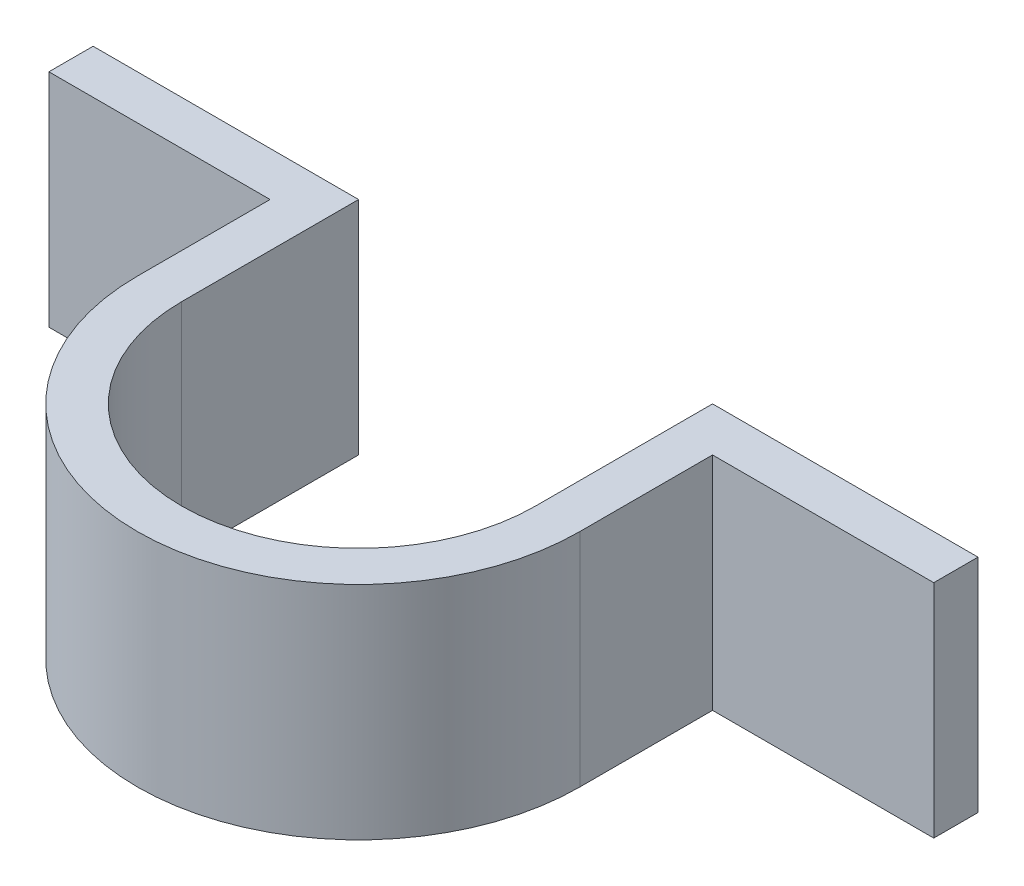
ISO-10303-21;
HEADER;
FILE_DESCRIPTION(('STEP AP214'),'2;1');
FILE_NAME('part.step','',(''),(''),'','','');
FILE_SCHEMA(('AUTOMOTIVE_DESIGN { 1 0 10303 214 1 1 1 1 }'));
ENDSEC;
DATA;
#1=APPLICATION_CONTEXT('core data for automotive mechanical design processes');
#2=APPLICATION_PROTOCOL_DEFINITION('international standard','automotive_design',2000,#1);
#3=PRODUCT_CONTEXT('',#1,'mechanical');
#4=PRODUCT('Part','Part','',(#3));
#5=PRODUCT_RELATED_PRODUCT_CATEGORY('part','',(#4));
#6=PRODUCT_DEFINITION_FORMATION('','',#4);
#7=PRODUCT_DEFINITION_CONTEXT('part definition',#1,'design');
#8=PRODUCT_DEFINITION('design','',#6,#7);
#9=PRODUCT_DEFINITION_SHAPE('','',#8);
#10=(LENGTH_UNIT() NAMED_UNIT(*) SI_UNIT(.MILLI.,.METRE.));
#11=(NAMED_UNIT(*) PLANE_ANGLE_UNIT() SI_UNIT($,.RADIAN.));
#12=(NAMED_UNIT(*) SI_UNIT($,.STERADIAN.) SOLID_ANGLE_UNIT());
#13=UNCERTAINTY_MEASURE_WITH_UNIT(LENGTH_MEASURE(1.E-05),#10,'distance_accuracy_value','');
#14=(GEOMETRIC_REPRESENTATION_CONTEXT(3) GLOBAL_UNCERTAINTY_ASSIGNED_CONTEXT((#13)) GLOBAL_UNIT_ASSIGNED_CONTEXT((#10,
#11,#12)) REPRESENTATION_CONTEXT('',''));
#15=CARTESIAN_POINT('',(0.,0.,0.));
#16=DIRECTION('',(0.,0.,1.));
#17=DIRECTION('',(1.,0.,0.));
#18=AXIS2_PLACEMENT_3D('',#15,#16,#17);
#19=CARTESIAN_POINT('',(0.,-2.5,0.));
#20=DIRECTION('',(0.,1.,0.));
#21=DIRECTION('',(0.,0.,1.));
#22=AXIS2_PLACEMENT_3D('',#19,#20,#21);
#23=CYLINDRICAL_SURFACE('',#22,4.);
#24=DIRECTION('',(0.,1.,0.));
#25=VECTOR('',#24,1.);
#26=CARTESIAN_POINT('',(-4.,-2.5,0.));
#27=LINE('',#26,#25);
#28=CARTESIAN_POINT('',(-4.,-2.5,0.));
#29=VERTEX_POINT('',#28);
#30=CARTESIAN_POINT('',(-4.,2.5,0.));
#31=VERTEX_POINT('',#30);
#32=EDGE_CURVE('E36',#29,#31,#27,.T.);
#33=ORIENTED_EDGE('',*,*,#32,.T.);
#34=CARTESIAN_POINT('',(0.,2.5,0.));
#35=DIRECTION('',(0.,-1.,0.));
#36=DIRECTION('',(0.,0.,1.));
#37=AXIS2_PLACEMENT_3D('',#34,#35,#36);
#38=CIRCLE('',#37,4.);
#39=CARTESIAN_POINT('',(4.,2.5,0.));
#40=VERTEX_POINT('',#39);
#41=EDGE_CURVE('E121',#40,#31,#38,.T.);
#42=ORIENTED_EDGE('',*,*,#41,.F.);
#43=DIRECTION('',(0.,1.,0.));
#44=VECTOR('',#43,1.);
#45=CARTESIAN_POINT('',(4.,-2.5,0.));
#46=LINE('',#45,#44);
#47=CARTESIAN_POINT('',(4.,-2.5,0.));
#48=VERTEX_POINT('',#47);
#49=EDGE_CURVE('E11',#48,#40,#46,.T.);
#50=ORIENTED_EDGE('',*,*,#49,.F.);
#51=CARTESIAN_POINT('',(0.,-2.5,0.));
#52=DIRECTION('',(0.,-1.,0.));
#53=DIRECTION('',(0.,0.,1.));
#54=AXIS2_PLACEMENT_3D('',#51,#52,#53);
#55=CIRCLE('',#54,4.);
#56=EDGE_CURVE('E122',#48,#29,#55,.T.);
#57=ORIENTED_EDGE('',*,*,#56,.T.);
#58=EDGE_LOOP('',(#33,#42,#50,#57));
#59=FACE_BOUND('',#58,.T.);
#60=ADVANCED_FACE('F33',(#59),#23,.F.);
#61=CARTESIAN_POINT('',(4.,-2.5,0.));
#62=DIRECTION('',(-1.,0.,0.));
#63=DIRECTION('',(0.,0.,1.));
#64=AXIS2_PLACEMENT_3D('',#61,#62,#63);
#65=PLANE('',#64);
#66=ORIENTED_EDGE('',*,*,#49,.T.);
#67=DIRECTION('',(0.,0.,1.));
#68=VECTOR('',#67,1.);
#69=CARTESIAN_POINT('',(4.,2.5,0.));
#70=LINE('',#69,#68);
#71=CARTESIAN_POINT('',(4.,2.5,-4.));
#72=VERTEX_POINT('',#71);
#73=EDGE_CURVE('E139',#72,#40,#70,.T.);
#74=ORIENTED_EDGE('',*,*,#73,.F.);
#75=DIRECTION('',(0.,1.,0.));
#76=VECTOR('',#75,1.);
#77=CARTESIAN_POINT('',(4.,-2.5,-4.));
#78=LINE('',#77,#76);
#79=CARTESIAN_POINT('',(4.,-2.5,-4.));
#80=VERTEX_POINT('',#79);
#81=EDGE_CURVE('E41',#80,#72,#78,.T.);
#82=ORIENTED_EDGE('',*,*,#81,.F.);
#83=DIRECTION('',(0.,0.,1.));
#84=VECTOR('',#83,1.);
#85=CARTESIAN_POINT('',(4.,-2.5,0.));
#86=LINE('',#85,#84);
#87=EDGE_CURVE('E127',#80,#48,#86,.T.);
#88=ORIENTED_EDGE('',*,*,#87,.T.);
#89=EDGE_LOOP('',(#66,#74,#82,#88));
#90=FACE_BOUND('',#89,.T.);
#91=ADVANCED_FACE('F251',(#90),#65,.T.);
#92=CARTESIAN_POINT('',(4.,-2.5,-4.));
#93=DIRECTION('',(0.,0.,-1.));
#94=DIRECTION('',(-1.,0.,0.));
#95=AXIS2_PLACEMENT_3D('',#92,#93,#94);
#96=PLANE('',#95);
#97=ORIENTED_EDGE('',*,*,#81,.T.);
#98=DIRECTION('',(-1.,0.,0.));
#99=VECTOR('',#98,1.);
#100=CARTESIAN_POINT('',(4.,2.5,-4.));
#101=LINE('',#100,#99);
#102=CARTESIAN_POINT('',(10.,2.5,-3.99999999999999));
#103=VERTEX_POINT('',#102);
#104=EDGE_CURVE('E164',#103,#72,#101,.T.);
#105=ORIENTED_EDGE('',*,*,#104,.F.);
#106=DIRECTION('',(0.,1.,0.));
#107=VECTOR('',#106,1.);
#108=CARTESIAN_POINT('',(10.,-2.5,-3.99999999999999));
#109=LINE('',#108,#107);
#110=CARTESIAN_POINT('',(10.,-2.5,-3.99999999999999));
#111=VERTEX_POINT('',#110);
#112=EDGE_CURVE('E198',#111,#103,#109,.T.);
#113=ORIENTED_EDGE('',*,*,#112,.F.);
#114=DIRECTION('',(-1.,0.,0.));
#115=VECTOR('',#114,1.);
#116=CARTESIAN_POINT('',(4.,-2.5,-4.));
#117=LINE('',#116,#115);
#118=EDGE_CURVE('E194',#111,#80,#117,.T.);
#119=ORIENTED_EDGE('',*,*,#118,.T.);
#120=EDGE_LOOP('',(#97,#105,#113,#119));
#121=FACE_BOUND('',#120,.T.);
#122=ADVANCED_FACE('F249',(#121),#96,.T.);
#123=CARTESIAN_POINT('',(10.,-2.5,-3.99999999999999));
#124=DIRECTION('',(1.,0.,0.));
#125=DIRECTION('',(0.,0.,-1.));
#126=AXIS2_PLACEMENT_3D('',#123,#124,#125);
#127=PLANE('',#126);
#128=ORIENTED_EDGE('',*,*,#112,.T.);
#129=DIRECTION('',(0.,0.,-1.));
#130=VECTOR('',#129,1.);
#131=CARTESIAN_POINT('',(10.,2.5,-3.99999999999999));
#132=LINE('',#131,#130);
#133=CARTESIAN_POINT('',(10.,2.5,-2.99999999999998));
#134=VERTEX_POINT('',#133);
#135=EDGE_CURVE('E161',#134,#103,#132,.T.);
#136=ORIENTED_EDGE('',*,*,#135,.F.);
#137=DIRECTION('',(0.,1.,0.));
#138=VECTOR('',#137,1.);
#139=CARTESIAN_POINT('',(10.,-2.5,-2.99999999999998));
#140=LINE('',#139,#138);
#141=CARTESIAN_POINT('',(10.,-2.5,-2.99999999999998));
#142=VERTEX_POINT('',#141);
#143=EDGE_CURVE('E200',#142,#134,#140,.T.);
#144=ORIENTED_EDGE('',*,*,#143,.F.);
#145=DIRECTION('',(0.,0.,-1.));
#146=VECTOR('',#145,1.);
#147=CARTESIAN_POINT('',(10.,-2.5,-3.99999999999999));
#148=LINE('',#147,#146);
#149=EDGE_CURVE('E191',#142,#111,#148,.T.);
#150=ORIENTED_EDGE('',*,*,#149,.T.);
#151=EDGE_LOOP('',(#128,#136,#144,#150));
#152=FACE_BOUND('',#151,.T.);
#153=ADVANCED_FACE('F247',(#152),#127,.T.);
#154=CARTESIAN_POINT('',(10.,-2.5,-2.99999999999998));
#155=DIRECTION('',(0.,0.,1.));
#156=DIRECTION('',(1.,0.,0.));
#157=AXIS2_PLACEMENT_3D('',#154,#155,#156);
#158=PLANE('',#157);
#159=ORIENTED_EDGE('',*,*,#143,.T.);
#160=DIRECTION('',(1.,0.,0.));
#161=VECTOR('',#160,1.);
#162=CARTESIAN_POINT('',(10.,2.5,-2.99999999999998));
#163=LINE('',#162,#161);
#164=CARTESIAN_POINT('',(5.,2.5,-3.));
#165=VERTEX_POINT('',#164);
#166=EDGE_CURVE('E158',#165,#134,#163,.T.);
#167=ORIENTED_EDGE('',*,*,#166,.F.);
#168=DIRECTION('',(0.,1.,0.));
#169=VECTOR('',#168,1.);
#170=CARTESIAN_POINT('',(5.,-2.5,-3.));
#171=LINE('',#170,#169);
#172=CARTESIAN_POINT('',(5.,-2.5,-3.));
#173=VERTEX_POINT('',#172);
#174=EDGE_CURVE('E202',#173,#165,#171,.T.);
#175=ORIENTED_EDGE('',*,*,#174,.F.);
#176=DIRECTION('',(1.,0.,0.));
#177=VECTOR('',#176,1.);
#178=CARTESIAN_POINT('',(10.,-2.5,-2.99999999999998));
#179=LINE('',#178,#177);
#180=EDGE_CURVE('E188',#173,#142,#179,.T.);
#181=ORIENTED_EDGE('',*,*,#180,.T.);
#182=EDGE_LOOP('',(#159,#167,#175,#181));
#183=FACE_BOUND('',#182,.T.);
#184=ADVANCED_FACE('F242',(#183),#158,.T.);
#185=CARTESIAN_POINT('',(5.,-2.5,-3.));
#186=DIRECTION('',(1.,0.,0.));
#187=DIRECTION('',(0.,0.,-1.));
#188=AXIS2_PLACEMENT_3D('',#185,#186,#187);
#189=PLANE('',#188);
#190=ORIENTED_EDGE('',*,*,#174,.T.);
#191=DIRECTION('',(0.,0.,-1.));
#192=VECTOR('',#191,1.);
#193=CARTESIAN_POINT('',(5.,2.5,-3.));
#194=LINE('',#193,#192);
#195=CARTESIAN_POINT('',(5.,2.5,0.));
#196=VERTEX_POINT('',#195);
#197=EDGE_CURVE('E155',#196,#165,#194,.T.);
#198=ORIENTED_EDGE('',*,*,#197,.F.);
#199=DIRECTION('',(0.,1.,0.));
#200=VECTOR('',#199,1.);
#201=CARTESIAN_POINT('',(5.,-2.5,0.));
#202=LINE('',#201,#200);
#203=CARTESIAN_POINT('',(5.,-2.5,0.));
#204=VERTEX_POINT('',#203);
#205=EDGE_CURVE('E204',#204,#196,#202,.T.);
#206=ORIENTED_EDGE('',*,*,#205,.F.);
#207=DIRECTION('',(0.,0.,-1.));
#208=VECTOR('',#207,1.);
#209=CARTESIAN_POINT('',(5.,-2.5,-3.));
#210=LINE('',#209,#208);
#211=EDGE_CURVE('E185',#204,#173,#210,.T.);
#212=ORIENTED_EDGE('',*,*,#211,.T.);
#213=EDGE_LOOP('',(#190,#198,#206,#212));
#214=FACE_BOUND('',#213,.T.);
#215=ADVANCED_FACE('F237',(#214),#189,.T.);
#216=CARTESIAN_POINT('',(0.,-2.5,0.));
#217=DIRECTION('',(0.,1.,0.));
#218=DIRECTION('',(0.,0.,1.));
#219=AXIS2_PLACEMENT_3D('',#216,#217,#218);
#220=CYLINDRICAL_SURFACE('',#219,5.);
#221=ORIENTED_EDGE('',*,*,#205,.T.);
#222=CARTESIAN_POINT('',(0.,2.5,0.));
#223=DIRECTION('',(0.,1.,0.));
#224=DIRECTION('',(0.,0.,1.));
#225=AXIS2_PLACEMENT_3D('',#222,#223,#224);
#226=CIRCLE('',#225,5.);
#227=CARTESIAN_POINT('',(-5.,2.5,0.));
#228=VERTEX_POINT('',#227);
#229=EDGE_CURVE('E152',#228,#196,#226,.T.);
#230=ORIENTED_EDGE('',*,*,#229,.F.);
#231=DIRECTION('',(0.,1.,0.));
#232=VECTOR('',#231,1.);
#233=CARTESIAN_POINT('',(-5.,-2.5,0.));
#234=LINE('',#233,#232);
#235=CARTESIAN_POINT('',(-5.,-2.5,0.));
#236=VERTEX_POINT('',#235);
#237=EDGE_CURVE('E206',#236,#228,#234,.T.);
#238=ORIENTED_EDGE('',*,*,#237,.F.);
#239=CARTESIAN_POINT('',(0.,-2.5,0.));
#240=DIRECTION('',(0.,1.,0.));
#241=DIRECTION('',(0.,0.,1.));
#242=AXIS2_PLACEMENT_3D('',#239,#240,#241);
#243=CIRCLE('',#242,5.);
#244=EDGE_CURVE('E182',#236,#204,#243,.T.);
#245=ORIENTED_EDGE('',*,*,#244,.T.);
#246=EDGE_LOOP('',(#221,#230,#238,#245));
#247=FACE_BOUND('',#246,.T.);
#248=ADVANCED_FACE('F235',(#247),#220,.T.);
#249=CARTESIAN_POINT('',(-5.,-2.5,-3.));
#250=DIRECTION('',(-1.,0.,0.));
#251=DIRECTION('',(0.,0.,1.));
#252=AXIS2_PLACEMENT_3D('',#249,#250,#251);
#253=PLANE('',#252);
#254=ORIENTED_EDGE('',*,*,#237,.T.);
#255=DIRECTION('',(0.,0.,1.));
#256=VECTOR('',#255,1.);
#257=CARTESIAN_POINT('',(-5.,2.5,-3.));
#258=LINE('',#257,#256);
#259=CARTESIAN_POINT('',(-5.,2.5,-3.));
#260=VERTEX_POINT('',#259);
#261=EDGE_CURVE('E149',#260,#228,#258,.T.);
#262=ORIENTED_EDGE('',*,*,#261,.F.);
#263=DIRECTION('',(0.,1.,0.));
#264=VECTOR('',#263,1.);
#265=CARTESIAN_POINT('',(-5.,-2.5,-3.));
#266=LINE('',#265,#264);
#267=CARTESIAN_POINT('',(-5.,-2.5,-3.));
#268=VERTEX_POINT('',#267);
#269=EDGE_CURVE('E208',#268,#260,#266,.T.);
#270=ORIENTED_EDGE('',*,*,#269,.F.);
#271=DIRECTION('',(0.,0.,1.));
#272=VECTOR('',#271,1.);
#273=CARTESIAN_POINT('',(-5.,-2.5,-3.));
#274=LINE('',#273,#272);
#275=EDGE_CURVE('E179',#268,#236,#274,.T.);
#276=ORIENTED_EDGE('',*,*,#275,.T.);
#277=EDGE_LOOP('',(#254,#262,#270,#276));
#278=FACE_BOUND('',#277,.T.);
#279=ADVANCED_FACE('F230',(#278),#253,.T.);
#280=CARTESIAN_POINT('',(-10.,-2.5,-3.));
#281=DIRECTION('',(0.,0.,1.));
#282=DIRECTION('',(1.,0.,0.));
#283=AXIS2_PLACEMENT_3D('',#280,#281,#282);
#284=PLANE('',#283);
#285=ORIENTED_EDGE('',*,*,#269,.T.);
#286=DIRECTION('',(1.,0.,0.));
#287=VECTOR('',#286,1.);
#288=CARTESIAN_POINT('',(-10.,2.5,-3.));
#289=LINE('',#288,#287);
#290=CARTESIAN_POINT('',(-10.,2.5,-3.));
#291=VERTEX_POINT('',#290);
#292=EDGE_CURVE('E146',#291,#260,#289,.T.);
#293=ORIENTED_EDGE('',*,*,#292,.F.);
#294=DIRECTION('',(0.,1.,0.));
#295=VECTOR('',#294,1.);
#296=CARTESIAN_POINT('',(-10.,-2.5,-3.));
#297=LINE('',#296,#295);
#298=CARTESIAN_POINT('',(-10.,-2.5,-3.));
#299=VERTEX_POINT('',#298);
#300=EDGE_CURVE('E210',#299,#291,#297,.T.);
#301=ORIENTED_EDGE('',*,*,#300,.F.);
#302=DIRECTION('',(1.,0.,0.));
#303=VECTOR('',#302,1.);
#304=CARTESIAN_POINT('',(-10.,-2.5,-3.));
#305=LINE('',#304,#303);
#306=EDGE_CURVE('E176',#299,#268,#305,.T.);
#307=ORIENTED_EDGE('',*,*,#306,.T.);
#308=EDGE_LOOP('',(#285,#293,#301,#307));
#309=FACE_BOUND('',#308,.T.);
#310=ADVANCED_FACE('F223',(#309),#284,.T.);
#311=CARTESIAN_POINT('',(-10.,-2.5,-4.));
#312=DIRECTION('',(-1.,0.,0.));
#313=DIRECTION('',(0.,0.,1.));
#314=AXIS2_PLACEMENT_3D('',#311,#312,#313);
#315=PLANE('',#314);
#316=ORIENTED_EDGE('',*,*,#300,.T.);
#317=DIRECTION('',(0.,0.,1.));
#318=VECTOR('',#317,1.);
#319=CARTESIAN_POINT('',(-10.,2.5,-4.));
#320=LINE('',#319,#318);
#321=CARTESIAN_POINT('',(-10.,2.5,-4.));
#322=VERTEX_POINT('',#321);
#323=EDGE_CURVE('E143',#322,#291,#320,.T.);
#324=ORIENTED_EDGE('',*,*,#323,.F.);
#325=DIRECTION('',(0.,1.,0.));
#326=VECTOR('',#325,1.);
#327=CARTESIAN_POINT('',(-10.,-2.5,-4.));
#328=LINE('',#327,#326);
#329=CARTESIAN_POINT('',(-10.,-2.5,-4.));
#330=VERTEX_POINT('',#329);
#331=EDGE_CURVE('E212',#330,#322,#328,.T.);
#332=ORIENTED_EDGE('',*,*,#331,.F.);
#333=DIRECTION('',(0.,0.,1.));
#334=VECTOR('',#333,1.);
#335=CARTESIAN_POINT('',(-10.,-2.5,-4.));
#336=LINE('',#335,#334);
#337=EDGE_CURVE('E173',#330,#299,#336,.T.);
#338=ORIENTED_EDGE('',*,*,#337,.T.);
#339=EDGE_LOOP('',(#316,#324,#332,#338));
#340=FACE_BOUND('',#339,.T.);
#341=ADVANCED_FACE('F220',(#340),#315,.T.);
#342=CARTESIAN_POINT('',(-4.,-2.5,-4.));
#343=DIRECTION('',(0.,0.,-1.));
#344=DIRECTION('',(-1.,0.,0.));
#345=AXIS2_PLACEMENT_3D('',#342,#343,#344);
#346=PLANE('',#345);
#347=ORIENTED_EDGE('',*,*,#331,.T.);
#348=DIRECTION('',(-1.,0.,0.));
#349=VECTOR('',#348,1.);
#350=CARTESIAN_POINT('',(-4.,2.5,-4.));
#351=LINE('',#350,#349);
#352=CARTESIAN_POINT('',(-4.,2.5,-4.));
#353=VERTEX_POINT('',#352);
#354=EDGE_CURVE('E134',#353,#322,#351,.T.);
#355=ORIENTED_EDGE('',*,*,#354,.F.);
#356=DIRECTION('',(0.,1.,0.));
#357=VECTOR('',#356,1.);
#358=CARTESIAN_POINT('',(-4.,-2.5,-4.));
#359=LINE('',#358,#357);
#360=CARTESIAN_POINT('',(-4.,-2.5,-4.));
#361=VERTEX_POINT('',#360);
#362=EDGE_CURVE('E126',#361,#353,#359,.T.);
#363=ORIENTED_EDGE('',*,*,#362,.F.);
#364=DIRECTION('',(-1.,0.,0.));
#365=VECTOR('',#364,1.);
#366=CARTESIAN_POINT('',(-4.,-2.5,-4.));
#367=LINE('',#366,#365);
#368=EDGE_CURVE('E170',#361,#330,#367,.T.);
#369=ORIENTED_EDGE('',*,*,#368,.T.);
#370=EDGE_LOOP('',(#347,#355,#363,#369));
#371=FACE_BOUND('',#370,.T.);
#372=ADVANCED_FACE('F214',(#371),#346,.T.);
#373=CARTESIAN_POINT('',(-4.,-2.5,0.));
#374=DIRECTION('',(1.,0.,0.));
#375=DIRECTION('',(0.,0.,-1.));
#376=AXIS2_PLACEMENT_3D('',#373,#374,#375);
#377=PLANE('',#376);
#378=ORIENTED_EDGE('',*,*,#362,.T.);
#379=DIRECTION('',(0.,0.,-1.));
#380=VECTOR('',#379,1.);
#381=CARTESIAN_POINT('',(-4.,2.5,0.));
#382=LINE('',#381,#380);
#383=EDGE_CURVE('E129',#31,#353,#382,.T.);
#384=ORIENTED_EDGE('',*,*,#383,.F.);
#385=ORIENTED_EDGE('',*,*,#32,.F.);
#386=DIRECTION('',(0.,0.,-1.));
#387=VECTOR('',#386,1.);
#388=CARTESIAN_POINT('',(-4.,-2.5,0.));
#389=LINE('',#388,#387);
#390=EDGE_CURVE('E168',#29,#361,#389,.T.);
#391=ORIENTED_EDGE('',*,*,#390,.T.);
#392=EDGE_LOOP('',(#378,#384,#385,#391));
#393=FACE_BOUND('',#392,.T.);
#394=ADVANCED_FACE('F130',(#393),#377,.T.);
#395=CARTESIAN_POINT('',(0.,-2.5,0.));
#396=DIRECTION('',(0.,1.,0.));
#397=DIRECTION('',(0.,0.,1.));
#398=AXIS2_PLACEMENT_3D('',#395,#396,#397);
#399=PLANE('',#398);
#400=ORIENTED_EDGE('',*,*,#56,.F.);
#401=ORIENTED_EDGE('',*,*,#87,.F.);
#402=ORIENTED_EDGE('',*,*,#118,.F.);
#403=ORIENTED_EDGE('',*,*,#149,.F.);
#404=ORIENTED_EDGE('',*,*,#180,.F.);
#405=ORIENTED_EDGE('',*,*,#211,.F.);
#406=ORIENTED_EDGE('',*,*,#244,.F.);
#407=ORIENTED_EDGE('',*,*,#275,.F.);
#408=ORIENTED_EDGE('',*,*,#306,.F.);
#409=ORIENTED_EDGE('',*,*,#337,.F.);
#410=ORIENTED_EDGE('',*,*,#368,.F.);
#411=ORIENTED_EDGE('',*,*,#390,.F.);
#412=EDGE_LOOP('',(#400,#401,#402,#403,#404,#405,#406,#407,#408,#409,#410,#411));
#413=FACE_BOUND('',#412,.T.);
#414=ADVANCED_FACE('F226',(#413),#399,.F.);
#415=CARTESIAN_POINT('',(0.,2.5,0.));
#416=DIRECTION('',(0.,1.,0.));
#417=DIRECTION('',(0.,0.,1.));
#418=AXIS2_PLACEMENT_3D('',#415,#416,#417);
#419=PLANE('',#418);
#420=ORIENTED_EDGE('',*,*,#41,.T.);
#421=ORIENTED_EDGE('',*,*,#383,.T.);
#422=ORIENTED_EDGE('',*,*,#354,.T.);
#423=ORIENTED_EDGE('',*,*,#323,.T.);
#424=ORIENTED_EDGE('',*,*,#292,.T.);
#425=ORIENTED_EDGE('',*,*,#261,.T.);
#426=ORIENTED_EDGE('',*,*,#229,.T.);
#427=ORIENTED_EDGE('',*,*,#197,.T.);
#428=ORIENTED_EDGE('',*,*,#166,.T.);
#429=ORIENTED_EDGE('',*,*,#135,.T.);
#430=ORIENTED_EDGE('',*,*,#104,.T.);
#431=ORIENTED_EDGE('',*,*,#73,.T.);
#432=EDGE_LOOP('',(#420,#421,#422,#423,#424,#425,#426,#427,#428,#429,#430,#431));
#433=FACE_BOUND('',#432,.T.);
#434=ADVANCED_FACE('F137',(#433),#419,.T.);
#435=CLOSED_SHELL('',(#60,#91,#122,#153,#184,#215,#248,#279,#310,#341,#372,#394,#414,#434));
#436=MANIFOLD_SOLID_BREP('B2',#435);
#437=ADVANCED_BREP_SHAPE_REPRESENTATION('',(#18,#436),#14);
#438=SHAPE_DEFINITION_REPRESENTATION(#9,#437);
ENDSEC;
END-ISO-10303-21;
